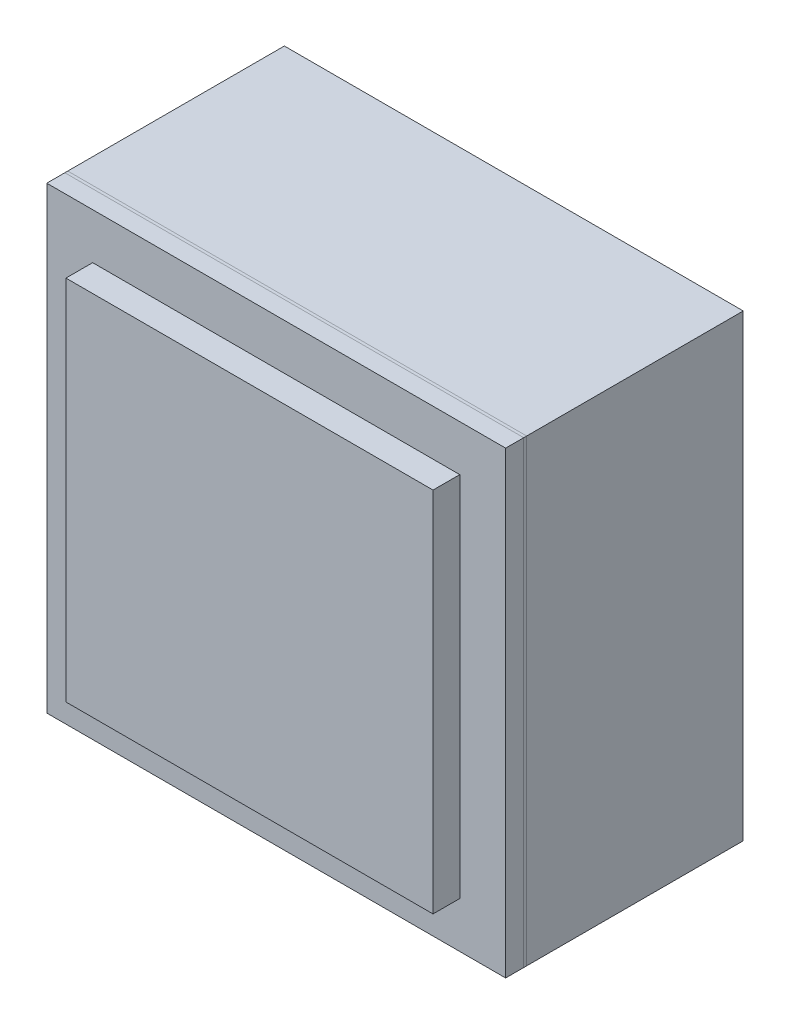
ISO-10303-21;
HEADER;
FILE_DESCRIPTION(('STEP AP214'),'2;1');
FILE_NAME('part.step','',(''),(''),'','','');
FILE_SCHEMA(('AUTOMOTIVE_DESIGN { 1 0 10303 214 1 1 1 1 }'));
ENDSEC;
DATA;
#1=APPLICATION_CONTEXT('core data for automotive mechanical design processes');
#2=APPLICATION_PROTOCOL_DEFINITION('international standard','automotive_design',2000,#1);
#3=PRODUCT_CONTEXT('',#1,'mechanical');
#4=PRODUCT('Part','Part','',(#3));
#5=PRODUCT_RELATED_PRODUCT_CATEGORY('part','',(#4));
#6=PRODUCT_DEFINITION_FORMATION('','',#4);
#7=PRODUCT_DEFINITION_CONTEXT('part definition',#1,'design');
#8=PRODUCT_DEFINITION('design','',#6,#7);
#9=PRODUCT_DEFINITION_SHAPE('','',#8);
#10=(LENGTH_UNIT() NAMED_UNIT(*) SI_UNIT(.MILLI.,.METRE.));
#11=(NAMED_UNIT(*) PLANE_ANGLE_UNIT() SI_UNIT($,.RADIAN.));
#12=(NAMED_UNIT(*) SI_UNIT($,.STERADIAN.) SOLID_ANGLE_UNIT());
#13=UNCERTAINTY_MEASURE_WITH_UNIT(LENGTH_MEASURE(1.E-05),#10,'distance_accuracy_value','');
#14=(GEOMETRIC_REPRESENTATION_CONTEXT(3) GLOBAL_UNCERTAINTY_ASSIGNED_CONTEXT((#13)) GLOBAL_UNIT_ASSIGNED_CONTEXT((#10,
#11,#12)) REPRESENTATION_CONTEXT('',''));
#15=CARTESIAN_POINT('',(0.,0.,0.));
#16=DIRECTION('',(0.,0.,1.));
#17=DIRECTION('',(1.,0.,0.));
#18=AXIS2_PLACEMENT_3D('',#15,#16,#17);
#19=CARTESIAN_POINT('',(12.7,12.7,0.));
#20=DIRECTION('',(0.,-1.,0.));
#21=DIRECTION('',(0.,0.,-1.));
#22=AXIS2_PLACEMENT_3D('',#19,#20,#21);
#23=PLANE('',#22);
#24=DIRECTION('',(0.,0.,1.));
#25=VECTOR('',#24,1.);
#26=CARTESIAN_POINT('',(-12.7,12.7,0.));
#27=LINE('',#26,#25);
#28=CARTESIAN_POINT('',(-12.7,12.7,8.9462));
#29=VERTEX_POINT('',#28);
#30=CARTESIAN_POINT('',(-12.7,12.7,10.795));
#31=VERTEX_POINT('',#30);
#32=EDGE_CURVE('E112',#29,#31,#27,.T.);
#33=ORIENTED_EDGE('',*,*,#32,.T.);
#34=DIRECTION('',(-1.,0.,0.));
#35=VECTOR('',#34,1.);
#36=CARTESIAN_POINT('',(12.7,12.7,10.795));
#37=LINE('',#36,#35);
#38=CARTESIAN_POINT('',(12.7,12.7,10.795));
#39=VERTEX_POINT('',#38);
#40=EDGE_CURVE('E12',#39,#31,#37,.T.);
#41=ORIENTED_EDGE('',*,*,#40,.F.);
#42=DIRECTION('',(0.,0.,1.));
#43=VECTOR('',#42,1.);
#44=CARTESIAN_POINT('',(12.7,12.7,0.));
#45=LINE('',#44,#43);
#46=CARTESIAN_POINT('',(12.7,12.7,8.9462));
#47=VERTEX_POINT('',#46);
#48=EDGE_CURVE('E97',#47,#39,#45,.T.);
#49=ORIENTED_EDGE('',*,*,#48,.F.);
#50=DIRECTION('',(-1.,0.,0.));
#51=VECTOR('',#50,1.);
#52=CARTESIAN_POINT('',(12.7,12.7,8.9462));
#53=LINE('',#52,#51);
#54=EDGE_CURVE('E108',#47,#29,#53,.T.);
#55=ORIENTED_EDGE('',*,*,#54,.T.);
#56=EDGE_LOOP('',(#33,#41,#49,#55));
#57=FACE_BOUND('',#56,.T.);
#58=ADVANCED_FACE('F50',(#57),#23,.F.);
#59=CARTESIAN_POINT('',(12.7,0.,10.795));
#60=DIRECTION('',(0.,0.,-1.));
#61=DIRECTION('',(-1.,0.,0.));
#62=AXIS2_PLACEMENT_3D('',#59,#60,#61);
#63=PLANE('',#62);
#64=DIRECTION('',(0.,-1.,0.));
#65=VECTOR('',#64,1.);
#66=CARTESIAN_POINT('',(-12.7,0.,10.795));
#67=LINE('',#66,#65);
#68=CARTESIAN_POINT('',(-12.7,-12.7,10.795));
#69=VERTEX_POINT('',#68);
#70=EDGE_CURVE('E102',#31,#69,#67,.T.);
#71=ORIENTED_EDGE('',*,*,#70,.T.);
#72=DIRECTION('',(-1.,0.,0.));
#73=VECTOR('',#72,1.);
#74=CARTESIAN_POINT('',(12.7,-12.7,10.795));
#75=LINE('',#74,#73);
#76=CARTESIAN_POINT('',(12.7,-12.7,10.795));
#77=VERTEX_POINT('',#76);
#78=EDGE_CURVE('E58',#77,#69,#75,.T.);
#79=ORIENTED_EDGE('',*,*,#78,.F.);
#80=DIRECTION('',(0.,-1.,0.));
#81=VECTOR('',#80,1.);
#82=CARTESIAN_POINT('',(12.7,0.,10.795));
#83=LINE('',#82,#81);
#84=EDGE_CURVE('E92',#39,#77,#83,.T.);
#85=ORIENTED_EDGE('',*,*,#84,.F.);
#86=ORIENTED_EDGE('',*,*,#40,.T.);
#87=EDGE_LOOP('',(#71,#79,#85,#86));
#88=FACE_BOUND('',#87,.T.);
#89=ADVANCED_FACE('F101',(#88),#63,.F.);
#90=CARTESIAN_POINT('',(12.7,-12.7,0.));
#91=DIRECTION('',(0.,-1.,0.));
#92=DIRECTION('',(0.,0.,-1.));
#93=AXIS2_PLACEMENT_3D('',#90,#91,#92);
#94=PLANE('',#93);
#95=DIRECTION('',(0.,0.,1.));
#96=VECTOR('',#95,1.);
#97=CARTESIAN_POINT('',(-12.7,-12.7,0.));
#98=LINE('',#97,#96);
#99=CARTESIAN_POINT('',(-12.7,-12.7,8.9462));
#100=VERTEX_POINT('',#99);
#101=EDGE_CURVE('E116',#100,#69,#98,.T.);
#102=ORIENTED_EDGE('',*,*,#101,.F.);
#103=DIRECTION('',(-1.,0.,0.));
#104=VECTOR('',#103,1.);
#105=CARTESIAN_POINT('',(12.7,-12.7,8.9462));
#106=LINE('',#105,#104);
#107=CARTESIAN_POINT('',(12.7,-12.7,8.9462));
#108=VERTEX_POINT('',#107);
#109=EDGE_CURVE('E82',#108,#100,#106,.T.);
#110=ORIENTED_EDGE('',*,*,#109,.F.);
#111=DIRECTION('',(0.,0.,1.));
#112=VECTOR('',#111,1.);
#113=CARTESIAN_POINT('',(12.7,-12.7,0.));
#114=LINE('',#113,#112);
#115=EDGE_CURVE('E95',#108,#77,#114,.T.);
#116=ORIENTED_EDGE('',*,*,#115,.T.);
#117=ORIENTED_EDGE('',*,*,#78,.T.);
#118=EDGE_LOOP('',(#102,#110,#116,#117));
#119=FACE_BOUND('',#118,.T.);
#120=ADVANCED_FACE('F106',(#119),#94,.T.);
#121=CARTESIAN_POINT('',(12.7,0.,8.9462));
#122=DIRECTION('',(0.,0.,1.));
#123=DIRECTION('',(1.,0.,0.));
#124=AXIS2_PLACEMENT_3D('',#121,#122,#123);
#125=PLANE('',#124);
#126=DIRECTION('',(0.,1.,0.));
#127=VECTOR('',#126,1.);
#128=CARTESIAN_POINT('',(-12.7,0.,8.9462));
#129=LINE('',#128,#127);
#130=EDGE_CURVE('E85',#100,#29,#129,.T.);
#131=ORIENTED_EDGE('',*,*,#130,.T.);
#132=ORIENTED_EDGE('',*,*,#54,.F.);
#133=DIRECTION('',(0.,1.,0.));
#134=VECTOR('',#133,1.);
#135=CARTESIAN_POINT('',(12.7,0.,8.9462));
#136=LINE('',#135,#134);
#137=EDGE_CURVE('E66',#108,#47,#136,.T.);
#138=ORIENTED_EDGE('',*,*,#137,.F.);
#139=ORIENTED_EDGE('',*,*,#109,.T.);
#140=EDGE_LOOP('',(#131,#132,#138,#139));
#141=FACE_BOUND('',#140,.T.);
#142=ADVANCED_FACE('F129',(#141),#125,.F.);
#143=CARTESIAN_POINT('',(12.7,0.,0.));
#144=DIRECTION('',(1.,0.,0.));
#145=DIRECTION('',(0.,0.,-1.));
#146=AXIS2_PLACEMENT_3D('',#143,#144,#145);
#147=PLANE('',#146);
#148=ORIENTED_EDGE('',*,*,#48,.T.);
#149=ORIENTED_EDGE('',*,*,#84,.T.);
#150=ORIENTED_EDGE('',*,*,#115,.F.);
#151=ORIENTED_EDGE('',*,*,#137,.T.);
#152=EDGE_LOOP('',(#148,#149,#150,#151));
#153=FACE_BOUND('',#152,.T.);
#154=ADVANCED_FACE('F93',(#153),#147,.T.);
#155=CARTESIAN_POINT('',(-12.7,0.,0.));
#156=DIRECTION('',(1.,0.,0.));
#157=DIRECTION('',(0.,0.,-1.));
#158=AXIS2_PLACEMENT_3D('',#155,#156,#157);
#159=PLANE('',#158);
#160=ORIENTED_EDGE('',*,*,#32,.F.);
#161=ORIENTED_EDGE('',*,*,#130,.F.);
#162=ORIENTED_EDGE('',*,*,#101,.T.);
#163=ORIENTED_EDGE('',*,*,#70,.F.);
#164=EDGE_LOOP('',(#160,#161,#162,#163));
#165=FACE_BOUND('',#164,.T.);
#166=ADVANCED_FACE('F123',(#165),#159,.F.);
#167=CLOSED_SHELL('',(#58,#89,#120,#142,#154,#166));
#168=MANIFOLD_SOLID_BREP('B2',#167);
#169=CARTESIAN_POINT('',(15.875,15.875,0.));
#170=DIRECTION('',(0.,-1.,0.));
#171=DIRECTION('',(0.,0.,-1.));
#172=AXIS2_PLACEMENT_3D('',#169,#170,#171);
#173=PLANE('',#172);
#174=DIRECTION('',(0.,0.,1.));
#175=VECTOR('',#174,1.);
#176=CARTESIAN_POINT('',(-15.875,15.875,0.));
#177=LINE('',#176,#175);
#178=CARTESIAN_POINT('',(-15.875,15.875,7.493));
#179=VERTEX_POINT('',#178);
#180=CARTESIAN_POINT('',(-15.875,15.875,7.6962));
#181=VERTEX_POINT('',#180);
#182=EDGE_CURVE('E250',#179,#181,#177,.T.);
#183=ORIENTED_EDGE('',*,*,#182,.T.);
#184=DIRECTION('',(-1.,0.,0.));
#185=VECTOR('',#184,1.);
#186=CARTESIAN_POINT('',(15.875,15.875,7.6962));
#187=LINE('',#186,#185);
#188=CARTESIAN_POINT('',(15.875,15.875,7.6962));
#189=VERTEX_POINT('',#188);
#190=EDGE_CURVE('E48',#189,#181,#187,.T.);
#191=ORIENTED_EDGE('',*,*,#190,.F.);
#192=DIRECTION('',(0.,0.,1.));
#193=VECTOR('',#192,1.);
#194=CARTESIAN_POINT('',(15.875,15.875,0.));
#195=LINE('',#194,#193);
#196=CARTESIAN_POINT('',(15.875,15.875,7.493));
#197=VERTEX_POINT('',#196);
#198=EDGE_CURVE('E236',#197,#189,#195,.T.);
#199=ORIENTED_EDGE('',*,*,#198,.F.);
#200=DIRECTION('',(-1.,0.,0.));
#201=VECTOR('',#200,1.);
#202=CARTESIAN_POINT('',(15.875,15.875,7.493));
#203=LINE('',#202,#201);
#204=EDGE_CURVE('E203',#197,#179,#203,.T.);
#205=ORIENTED_EDGE('',*,*,#204,.T.);
#206=EDGE_LOOP('',(#183,#191,#199,#205));
#207=FACE_BOUND('',#206,.T.);
#208=ADVANCED_FACE('F187',(#207),#173,.F.);
#209=CARTESIAN_POINT('',(15.875,0.,7.6962));
#210=DIRECTION('',(0.,0.,-1.));
#211=DIRECTION('',(-1.,0.,0.));
#212=AXIS2_PLACEMENT_3D('',#209,#210,#211);
#213=PLANE('',#212);
#214=DIRECTION('',(0.,-1.,0.));
#215=VECTOR('',#214,1.);
#216=CARTESIAN_POINT('',(-15.875,0.,7.6962));
#217=LINE('',#216,#215);
#218=CARTESIAN_POINT('',(-15.875,-15.875,7.6962));
#219=VERTEX_POINT('',#218);
#220=EDGE_CURVE('E241',#181,#219,#217,.T.);
#221=ORIENTED_EDGE('',*,*,#220,.T.);
#222=DIRECTION('',(-1.,0.,0.));
#223=VECTOR('',#222,1.);
#224=CARTESIAN_POINT('',(15.875,-15.875,7.6962));
#225=LINE('',#224,#223);
#226=CARTESIAN_POINT('',(15.875,-15.875,7.6962));
#227=VERTEX_POINT('',#226);
#228=EDGE_CURVE('E195',#227,#219,#225,.T.);
#229=ORIENTED_EDGE('',*,*,#228,.F.);
#230=DIRECTION('',(0.,-1.,0.));
#231=VECTOR('',#230,1.);
#232=CARTESIAN_POINT('',(15.875,0.,7.6962));
#233=LINE('',#232,#231);
#234=EDGE_CURVE('E228',#189,#227,#233,.T.);
#235=ORIENTED_EDGE('',*,*,#234,.F.);
#236=ORIENTED_EDGE('',*,*,#190,.T.);
#237=EDGE_LOOP('',(#221,#229,#235,#236));
#238=FACE_BOUND('',#237,.T.);
#239=ADVANCED_FACE('F240',(#238),#213,.F.);
#240=CARTESIAN_POINT('',(15.875,-15.875,0.));
#241=DIRECTION('',(0.,-1.,0.));
#242=DIRECTION('',(0.,0.,-1.));
#243=AXIS2_PLACEMENT_3D('',#240,#241,#242);
#244=PLANE('',#243);
#245=DIRECTION('',(0.,0.,1.));
#246=VECTOR('',#245,1.);
#247=CARTESIAN_POINT('',(-15.875,-15.875,0.));
#248=LINE('',#247,#246);
#249=CARTESIAN_POINT('',(-15.875,-15.875,7.493));
#250=VERTEX_POINT('',#249);
#251=EDGE_CURVE('E253',#250,#219,#248,.T.);
#252=ORIENTED_EDGE('',*,*,#251,.F.);
#253=DIRECTION('',(-1.,0.,0.));
#254=VECTOR('',#253,1.);
#255=CARTESIAN_POINT('',(15.875,-15.875,7.493));
#256=LINE('',#255,#254);
#257=CARTESIAN_POINT('',(15.875,-15.875,7.493));
#258=VERTEX_POINT('',#257);
#259=EDGE_CURVE('E217',#258,#250,#256,.T.);
#260=ORIENTED_EDGE('',*,*,#259,.F.);
#261=DIRECTION('',(0.,0.,1.));
#262=VECTOR('',#261,1.);
#263=CARTESIAN_POINT('',(15.875,-15.875,0.));
#264=LINE('',#263,#262);
#265=EDGE_CURVE('E235',#258,#227,#264,.T.);
#266=ORIENTED_EDGE('',*,*,#265,.T.);
#267=ORIENTED_EDGE('',*,*,#228,.T.);
#268=EDGE_LOOP('',(#252,#260,#266,#267));
#269=FACE_BOUND('',#268,.T.);
#270=ADVANCED_FACE('F244',(#269),#244,.T.);
#271=CARTESIAN_POINT('',(15.875,0.,7.493));
#272=DIRECTION('',(0.,0.,-1.));
#273=DIRECTION('',(0.,1.,0.));
#274=AXIS2_PLACEMENT_3D('',#271,#272,#273);
#275=PLANE('',#274);
#276=DIRECTION('',(0.,-1.,0.));
#277=VECTOR('',#276,1.);
#278=CARTESIAN_POINT('',(-15.875,0.,7.493));
#279=LINE('',#278,#277);
#280=EDGE_CURVE('E255',#179,#250,#279,.T.);
#281=ORIENTED_EDGE('',*,*,#280,.F.);
#282=ORIENTED_EDGE('',*,*,#204,.F.);
#283=DIRECTION('',(0.,-1.,0.));
#284=VECTOR('',#283,1.);
#285=CARTESIAN_POINT('',(15.875,0.,7.493));
#286=LINE('',#285,#284);
#287=EDGE_CURVE('E245',#197,#258,#286,.T.);
#288=ORIENTED_EDGE('',*,*,#287,.T.);
#289=ORIENTED_EDGE('',*,*,#259,.T.);
#290=EDGE_LOOP('',(#281,#282,#288,#289));
#291=FACE_BOUND('',#290,.T.);
#292=ADVANCED_FACE('F261',(#291),#275,.T.);
#293=CARTESIAN_POINT('',(15.875,0.,0.));
#294=DIRECTION('',(1.,0.,0.));
#295=DIRECTION('',(0.,0.,-1.));
#296=AXIS2_PLACEMENT_3D('',#293,#294,#295);
#297=PLANE('',#296);
#298=ORIENTED_EDGE('',*,*,#198,.T.);
#299=ORIENTED_EDGE('',*,*,#234,.T.);
#300=ORIENTED_EDGE('',*,*,#265,.F.);
#301=ORIENTED_EDGE('',*,*,#287,.F.);
#302=EDGE_LOOP('',(#298,#299,#300,#301));
#303=FACE_BOUND('',#302,.T.);
#304=ADVANCED_FACE('F232',(#303),#297,.T.);
#305=CARTESIAN_POINT('',(-15.875,0.,0.));
#306=DIRECTION('',(1.,0.,0.));
#307=DIRECTION('',(0.,0.,-1.));
#308=AXIS2_PLACEMENT_3D('',#305,#306,#307);
#309=PLANE('',#308);
#310=ORIENTED_EDGE('',*,*,#182,.F.);
#311=ORIENTED_EDGE('',*,*,#280,.T.);
#312=ORIENTED_EDGE('',*,*,#251,.T.);
#313=ORIENTED_EDGE('',*,*,#220,.F.);
#314=EDGE_LOOP('',(#310,#311,#312,#313));
#315=FACE_BOUND('',#314,.T.);
#316=ADVANCED_FACE('F260',(#315),#309,.F.);
#317=CLOSED_SHELL('',(#208,#239,#270,#292,#304,#316));
#318=MANIFOLD_SOLID_BREP('B6',#317);
#319=CARTESIAN_POINT('',(15.875,0.,8.9462));
#320=DIRECTION('',(0.,0.,1.));
#321=DIRECTION('',(1.,0.,0.));
#322=AXIS2_PLACEMENT_3D('',#319,#320,#321);
#323=PLANE('',#322);
#324=DIRECTION('',(0.,1.,0.));
#325=VECTOR('',#324,1.);
#326=CARTESIAN_POINT('',(-15.875,0.,8.9462));
#327=LINE('',#326,#325);
#328=CARTESIAN_POINT('',(-15.875,-15.875,8.9462));
#329=VERTEX_POINT('',#328);
#330=CARTESIAN_POINT('',(-15.875,15.875,8.9462));
#331=VERTEX_POINT('',#330);
#332=EDGE_CURVE('E389',#329,#331,#327,.T.);
#333=ORIENTED_EDGE('',*,*,#332,.F.);
#334=DIRECTION('',(-1.,0.,0.));
#335=VECTOR('',#334,1.);
#336=CARTESIAN_POINT('',(15.875,-15.875,8.9462));
#337=LINE('',#336,#335);
#338=CARTESIAN_POINT('',(15.875,-15.875,8.9462));
#339=VERTEX_POINT('',#338);
#340=EDGE_CURVE('E185',#339,#329,#337,.T.);
#341=ORIENTED_EDGE('',*,*,#340,.F.);
#342=DIRECTION('',(0.,1.,0.));
#343=VECTOR('',#342,1.);
#344=CARTESIAN_POINT('',(15.875,0.,8.9462));
#345=LINE('',#344,#343);
#346=CARTESIAN_POINT('',(15.875,15.875,8.9462));
#347=VERTEX_POINT('',#346);
#348=EDGE_CURVE('E382',#339,#347,#345,.T.);
#349=ORIENTED_EDGE('',*,*,#348,.T.);
#350=DIRECTION('',(-1.,0.,0.));
#351=VECTOR('',#350,1.);
#352=CARTESIAN_POINT('',(15.875,15.875,8.9462));
#353=LINE('',#352,#351);
#354=EDGE_CURVE('E364',#347,#331,#353,.T.);
#355=ORIENTED_EDGE('',*,*,#354,.T.);
#356=EDGE_LOOP('',(#333,#341,#349,#355));
#357=FACE_BOUND('',#356,.T.);
#358=ADVANCED_FACE('F326',(#357),#323,.T.);
#359=CARTESIAN_POINT('',(15.875,-15.875,0.));
#360=DIRECTION('',(0.,-1.,0.));
#361=DIRECTION('',(0.,0.,-1.));
#362=AXIS2_PLACEMENT_3D('',#359,#360,#361);
#363=PLANE('',#362);
#364=DIRECTION('',(0.,0.,1.));
#365=VECTOR('',#364,1.);
#366=CARTESIAN_POINT('',(-15.875,-15.875,0.));
#367=LINE('',#366,#365);
#368=CARTESIAN_POINT('',(-15.875,-15.875,7.6962));
#369=VERTEX_POINT('',#368);
#370=EDGE_CURVE('E375',#369,#329,#367,.T.);
#371=ORIENTED_EDGE('',*,*,#370,.F.);
#372=DIRECTION('',(-1.,0.,0.));
#373=VECTOR('',#372,1.);
#374=CARTESIAN_POINT('',(15.875,-15.875,7.6962));
#375=LINE('',#374,#373);
#376=CARTESIAN_POINT('',(15.875,-15.875,7.6962));
#377=VERTEX_POINT('',#376);
#378=EDGE_CURVE('E334',#377,#369,#375,.T.);
#379=ORIENTED_EDGE('',*,*,#378,.F.);
#380=DIRECTION('',(0.,0.,1.));
#381=VECTOR('',#380,1.);
#382=CARTESIAN_POINT('',(15.875,-15.875,0.));
#383=LINE('',#382,#381);
#384=EDGE_CURVE('E373',#377,#339,#383,.T.);
#385=ORIENTED_EDGE('',*,*,#384,.T.);
#386=ORIENTED_EDGE('',*,*,#340,.T.);
#387=EDGE_LOOP('',(#371,#379,#385,#386));
#388=FACE_BOUND('',#387,.T.);
#389=ADVANCED_FACE('F372',(#388),#363,.T.);
#390=CARTESIAN_POINT('',(15.875,0.,7.6962));
#391=DIRECTION('',(0.,0.,-1.));
#392=DIRECTION('',(-1.,0.,0.));
#393=AXIS2_PLACEMENT_3D('',#390,#391,#392);
#394=PLANE('',#393);
#395=DIRECTION('',(0.,-1.,0.));
#396=VECTOR('',#395,1.);
#397=CARTESIAN_POINT('',(-15.875,0.,7.6962));
#398=LINE('',#397,#396);
#399=CARTESIAN_POINT('',(-15.875,15.875,7.6962));
#400=VERTEX_POINT('',#399);
#401=EDGE_CURVE('E393',#400,#369,#398,.T.);
#402=ORIENTED_EDGE('',*,*,#401,.F.);
#403=DIRECTION('',(-1.,0.,0.));
#404=VECTOR('',#403,1.);
#405=CARTESIAN_POINT('',(15.875,15.875,7.6962));
#406=LINE('',#405,#404);
#407=CARTESIAN_POINT('',(15.875,15.875,7.6962));
#408=VERTEX_POINT('',#407);
#409=EDGE_CURVE('E357',#408,#400,#406,.T.);
#410=ORIENTED_EDGE('',*,*,#409,.F.);
#411=DIRECTION('',(0.,-1.,0.));
#412=VECTOR('',#411,1.);
#413=CARTESIAN_POINT('',(15.875,0.,7.6962));
#414=LINE('',#413,#412);
#415=EDGE_CURVE('E381',#408,#377,#414,.T.);
#416=ORIENTED_EDGE('',*,*,#415,.T.);
#417=ORIENTED_EDGE('',*,*,#378,.T.);
#418=EDGE_LOOP('',(#402,#410,#416,#417));
#419=FACE_BOUND('',#418,.T.);
#420=ADVANCED_FACE('F384',(#419),#394,.T.);
#421=CARTESIAN_POINT('',(15.875,15.875,0.));
#422=DIRECTION('',(0.,-1.,0.));
#423=DIRECTION('',(0.,0.,-1.));
#424=AXIS2_PLACEMENT_3D('',#421,#422,#423);
#425=PLANE('',#424);
#426=DIRECTION('',(0.,0.,1.));
#427=VECTOR('',#426,1.);
#428=CARTESIAN_POINT('',(-15.875,15.875,0.));
#429=LINE('',#428,#427);
#430=EDGE_CURVE('E395',#400,#331,#429,.T.);
#431=ORIENTED_EDGE('',*,*,#430,.T.);
#432=ORIENTED_EDGE('',*,*,#354,.F.);
#433=DIRECTION('',(0.,0.,1.));
#434=VECTOR('',#433,1.);
#435=CARTESIAN_POINT('',(15.875,15.875,0.));
#436=LINE('',#435,#434);
#437=EDGE_CURVE('E342',#408,#347,#436,.T.);
#438=ORIENTED_EDGE('',*,*,#437,.F.);
#439=ORIENTED_EDGE('',*,*,#409,.T.);
#440=EDGE_LOOP('',(#431,#432,#438,#439));
#441=FACE_BOUND('',#440,.T.);
#442=ADVANCED_FACE('F405',(#441),#425,.F.);
#443=CARTESIAN_POINT('',(15.875,0.,0.));
#444=DIRECTION('',(1.,0.,0.));
#445=DIRECTION('',(0.,0.,-1.));
#446=AXIS2_PLACEMENT_3D('',#443,#444,#445);
#447=PLANE('',#446);
#448=ORIENTED_EDGE('',*,*,#348,.F.);
#449=ORIENTED_EDGE('',*,*,#384,.F.);
#450=ORIENTED_EDGE('',*,*,#415,.F.);
#451=ORIENTED_EDGE('',*,*,#437,.T.);
#452=EDGE_LOOP('',(#448,#449,#450,#451));
#453=FACE_BOUND('',#452,.T.);
#454=ADVANCED_FACE('F380',(#453),#447,.T.);
#455=CARTESIAN_POINT('',(-15.875,0.,0.));
#456=DIRECTION('',(1.,0.,0.));
#457=DIRECTION('',(0.,0.,-1.));
#458=AXIS2_PLACEMENT_3D('',#455,#456,#457);
#459=PLANE('',#458);
#460=ORIENTED_EDGE('',*,*,#332,.T.);
#461=ORIENTED_EDGE('',*,*,#430,.F.);
#462=ORIENTED_EDGE('',*,*,#401,.T.);
#463=ORIENTED_EDGE('',*,*,#370,.T.);
#464=EDGE_LOOP('',(#460,#461,#462,#463));
#465=FACE_BOUND('',#464,.T.);
#466=ADVANCED_FACE('F410',(#465),#459,.F.);
#467=CLOSED_SHELL('',(#358,#389,#420,#442,#454,#466));
#468=MANIFOLD_SOLID_BREP('B42',#467);
#469=CARTESIAN_POINT('',(15.875,0.,-7.493));
#470=DIRECTION('',(0.,0.,-1.));
#471=DIRECTION('',(0.,1.,0.));
#472=AXIS2_PLACEMENT_3D('',#469,#470,#471);
#473=PLANE('',#472);
#474=DIRECTION('',(0.,-1.,0.));
#475=VECTOR('',#474,1.);
#476=CARTESIAN_POINT('',(-15.875,0.,-7.493));
#477=LINE('',#476,#475);
#478=CARTESIAN_POINT('',(-15.875,15.875,-7.493));
#479=VERTEX_POINT('',#478);
#480=CARTESIAN_POINT('',(-15.875,-15.875,-7.493));
#481=VERTEX_POINT('',#480);
#482=EDGE_CURVE('E519',#479,#481,#477,.T.);
#483=ORIENTED_EDGE('',*,*,#482,.F.);
#484=DIRECTION('',(-1.,0.,0.));
#485=VECTOR('',#484,1.);
#486=CARTESIAN_POINT('',(15.875,15.875,-7.493));
#487=LINE('',#486,#485);
#488=CARTESIAN_POINT('',(15.875,15.875,-7.493));
#489=VERTEX_POINT('',#488);
#490=EDGE_CURVE('E324',#489,#479,#487,.T.);
#491=ORIENTED_EDGE('',*,*,#490,.F.);
#492=DIRECTION('',(0.,-1.,0.));
#493=VECTOR('',#492,1.);
#494=CARTESIAN_POINT('',(15.875,0.,-7.493));
#495=LINE('',#494,#493);
#496=CARTESIAN_POINT('',(15.875,-15.875,-7.493));
#497=VERTEX_POINT('',#496);
#498=EDGE_CURVE('E513',#489,#497,#495,.T.);
#499=ORIENTED_EDGE('',*,*,#498,.T.);
#500=DIRECTION('',(-1.,0.,0.));
#501=VECTOR('',#500,1.);
#502=CARTESIAN_POINT('',(15.875,-15.875,-7.493));
#503=LINE('',#502,#501);
#504=EDGE_CURVE('E494',#497,#481,#503,.T.);
#505=ORIENTED_EDGE('',*,*,#504,.T.);
#506=EDGE_LOOP('',(#483,#491,#499,#505));
#507=FACE_BOUND('',#506,.T.);
#508=ADVANCED_FACE('F456',(#507),#473,.T.);
#509=CARTESIAN_POINT('',(15.875,15.875,0.));
#510=DIRECTION('',(0.,1.,0.));
#511=DIRECTION('',(0.,0.,1.));
#512=AXIS2_PLACEMENT_3D('',#509,#510,#511);
#513=PLANE('',#512);
#514=DIRECTION('',(0.,0.,-1.));
#515=VECTOR('',#514,1.);
#516=CARTESIAN_POINT('',(-15.875,15.875,0.));
#517=LINE('',#516,#515);
#518=CARTESIAN_POINT('',(-15.875,15.875,7.493));
#519=VERTEX_POINT('',#518);
#520=EDGE_CURVE('E507',#519,#479,#517,.T.);
#521=ORIENTED_EDGE('',*,*,#520,.F.);
#522=DIRECTION('',(-1.,0.,0.));
#523=VECTOR('',#522,1.);
#524=CARTESIAN_POINT('',(15.875,15.875,7.493));
#525=LINE('',#524,#523);
#526=CARTESIAN_POINT('',(15.875,15.875,7.493));
#527=VERTEX_POINT('',#526);
#528=EDGE_CURVE('E464',#527,#519,#525,.T.);
#529=ORIENTED_EDGE('',*,*,#528,.F.);
#530=DIRECTION('',(0.,0.,-1.));
#531=VECTOR('',#530,1.);
#532=CARTESIAN_POINT('',(15.875,15.875,0.));
#533=LINE('',#532,#531);
#534=EDGE_CURVE('E505',#527,#489,#533,.T.);
#535=ORIENTED_EDGE('',*,*,#534,.T.);
#536=ORIENTED_EDGE('',*,*,#490,.T.);
#537=EDGE_LOOP('',(#521,#529,#535,#536));
#538=FACE_BOUND('',#537,.T.);
#539=ADVANCED_FACE('F503',(#538),#513,.T.);
#540=CARTESIAN_POINT('',(15.875,0.,7.493));
#541=DIRECTION('',(0.,0.,-1.));
#542=DIRECTION('',(0.,1.,0.));
#543=AXIS2_PLACEMENT_3D('',#540,#541,#542);
#544=PLANE('',#543);
#545=DIRECTION('',(0.,-1.,0.));
#546=VECTOR('',#545,1.);
#547=CARTESIAN_POINT('',(-15.875,0.,7.493));
#548=LINE('',#547,#546);
#549=CARTESIAN_POINT('',(-15.875,-15.875,7.493));
#550=VERTEX_POINT('',#549);
#551=EDGE_CURVE('E487',#519,#550,#548,.T.);
#552=ORIENTED_EDGE('',*,*,#551,.T.);
#553=DIRECTION('',(-1.,0.,0.));
#554=VECTOR('',#553,1.);
#555=CARTESIAN_POINT('',(15.875,-15.875,7.493));
#556=LINE('',#555,#554);
#557=CARTESIAN_POINT('',(15.875,-15.875,7.493));
#558=VERTEX_POINT('',#557);
#559=EDGE_CURVE('E508',#558,#550,#556,.T.);
#560=ORIENTED_EDGE('',*,*,#559,.F.);
#561=DIRECTION('',(0.,-1.,0.));
#562=VECTOR('',#561,1.);
#563=CARTESIAN_POINT('',(15.875,0.,7.493));
#564=LINE('',#563,#562);
#565=EDGE_CURVE('E509',#527,#558,#564,.T.);
#566=ORIENTED_EDGE('',*,*,#565,.F.);
#567=ORIENTED_EDGE('',*,*,#528,.T.);
#568=EDGE_LOOP('',(#552,#560,#566,#567));
#569=FACE_BOUND('',#568,.T.);
#570=ADVANCED_FACE('F510',(#569),#544,.F.);
#571=CARTESIAN_POINT('',(15.875,-15.875,0.));
#572=DIRECTION('',(0.,1.,0.));
#573=DIRECTION('',(0.,0.,1.));
#574=AXIS2_PLACEMENT_3D('',#571,#572,#573);
#575=PLANE('',#574);
#576=DIRECTION('',(0.,0.,-1.));
#577=VECTOR('',#576,1.);
#578=CARTESIAN_POINT('',(-15.875,-15.875,0.));
#579=LINE('',#578,#577);
#580=EDGE_CURVE('E515',#550,#481,#579,.T.);
#581=ORIENTED_EDGE('',*,*,#580,.T.);
#582=ORIENTED_EDGE('',*,*,#504,.F.);
#583=DIRECTION('',(0.,0.,-1.));
#584=VECTOR('',#583,1.);
#585=CARTESIAN_POINT('',(15.875,-15.875,0.));
#586=LINE('',#585,#584);
#587=EDGE_CURVE('E472',#558,#497,#586,.T.);
#588=ORIENTED_EDGE('',*,*,#587,.F.);
#589=ORIENTED_EDGE('',*,*,#559,.T.);
#590=EDGE_LOOP('',(#581,#582,#588,#589));
#591=FACE_BOUND('',#590,.T.);
#592=ADVANCED_FACE('F528',(#591),#575,.F.);
#593=CARTESIAN_POINT('',(15.875,0.,0.));
#594=DIRECTION('',(1.,0.,0.));
#595=DIRECTION('',(0.,0.,-1.));
#596=AXIS2_PLACEMENT_3D('',#593,#594,#595);
#597=PLANE('',#596);
#598=ORIENTED_EDGE('',*,*,#498,.F.);
#599=ORIENTED_EDGE('',*,*,#534,.F.);
#600=ORIENTED_EDGE('',*,*,#565,.T.);
#601=ORIENTED_EDGE('',*,*,#587,.T.);
#602=EDGE_LOOP('',(#598,#599,#600,#601));
#603=FACE_BOUND('',#602,.T.);
#604=ADVANCED_FACE('F512',(#603),#597,.T.);
#605=CARTESIAN_POINT('',(-15.875,0.,0.));
#606=DIRECTION('',(1.,0.,0.));
#607=DIRECTION('',(0.,0.,-1.));
#608=AXIS2_PLACEMENT_3D('',#605,#606,#607);
#609=PLANE('',#608);
#610=ORIENTED_EDGE('',*,*,#482,.T.);
#611=ORIENTED_EDGE('',*,*,#580,.F.);
#612=ORIENTED_EDGE('',*,*,#551,.F.);
#613=ORIENTED_EDGE('',*,*,#520,.T.);
#614=EDGE_LOOP('',(#610,#611,#612,#613));
#615=FACE_BOUND('',#614,.T.);
#616=ADVANCED_FACE('F530',(#615),#609,.F.);
#617=CLOSED_SHELL('',(#508,#539,#570,#592,#604,#616));
#618=MANIFOLD_SOLID_BREP('B179',#617);
#619=ADVANCED_BREP_SHAPE_REPRESENTATION('',(#18,#168,#318,#468,#618),#14);
#620=SHAPE_DEFINITION_REPRESENTATION(#9,#619);
ENDSEC;
END-ISO-10303-21;
